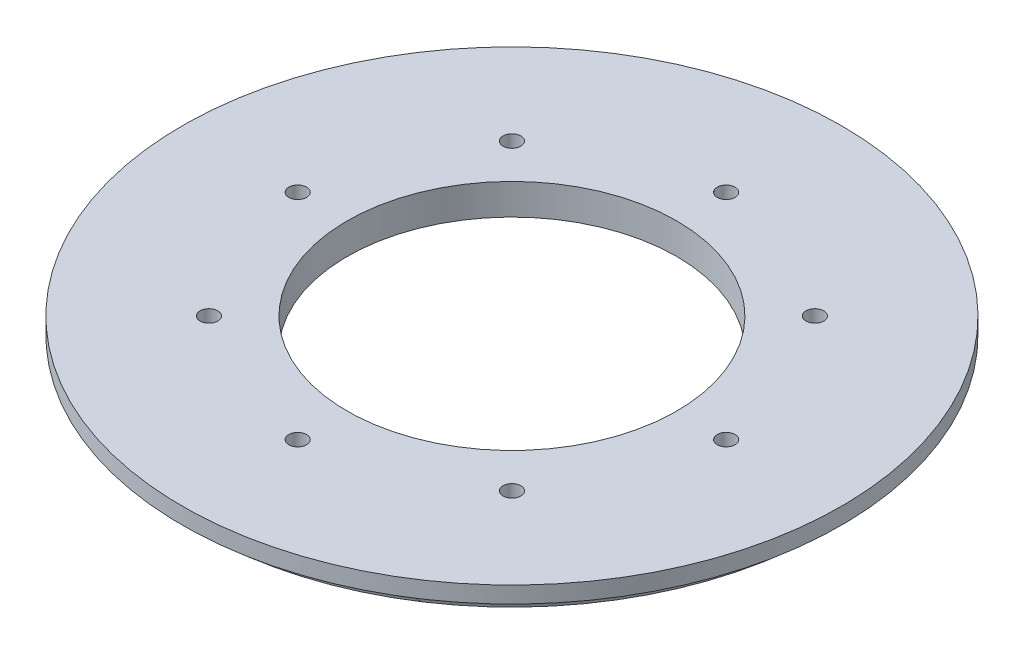
ISO-10303-21;
HEADER;
FILE_DESCRIPTION(('STEP AP214'),'2;1');
FILE_NAME('part.step','',(''),(''),'','','');
FILE_SCHEMA(('AUTOMOTIVE_DESIGN { 1 0 10303 214 1 1 1 1 }'));
ENDSEC;
DATA;
#1=APPLICATION_CONTEXT('core data for automotive mechanical design processes');
#2=APPLICATION_PROTOCOL_DEFINITION('international standard','automotive_design',2000,#1);
#3=PRODUCT_CONTEXT('',#1,'mechanical');
#4=PRODUCT('Part','Part','',(#3));
#5=PRODUCT_RELATED_PRODUCT_CATEGORY('part','',(#4));
#6=PRODUCT_DEFINITION_FORMATION('','',#4);
#7=PRODUCT_DEFINITION_CONTEXT('part definition',#1,'design');
#8=PRODUCT_DEFINITION('design','',#6,#7);
#9=PRODUCT_DEFINITION_SHAPE('','',#8);
#10=(LENGTH_UNIT() NAMED_UNIT(*) SI_UNIT(.MILLI.,.METRE.));
#11=(NAMED_UNIT(*) PLANE_ANGLE_UNIT() SI_UNIT($,.RADIAN.));
#12=(NAMED_UNIT(*) SI_UNIT($,.STERADIAN.) SOLID_ANGLE_UNIT());
#13=UNCERTAINTY_MEASURE_WITH_UNIT(LENGTH_MEASURE(1.E-05),#10,'distance_accuracy_value','');
#14=(GEOMETRIC_REPRESENTATION_CONTEXT(3) GLOBAL_UNCERTAINTY_ASSIGNED_CONTEXT((#13)) GLOBAL_UNIT_ASSIGNED_CONTEXT((#10,
#11,#12)) REPRESENTATION_CONTEXT('',''));
#15=CARTESIAN_POINT('',(0.,0.,0.));
#16=DIRECTION('',(0.,0.,1.));
#17=DIRECTION('',(1.,0.,0.));
#18=AXIS2_PLACEMENT_3D('',#15,#16,#17);
#19=CARTESIAN_POINT('',(0.,4.99993705254392,0.));
#20=DIRECTION('',(0.,-1.,0.));
#21=DIRECTION('',(0.,0.,-1.));
#22=AXIS2_PLACEMENT_3D('',#19,#20,#21);
#23=PLANE('',#22);
#24=CARTESIAN_POINT('',(3.7245254199048E-12,4.99993705254392,0.));
#25=DIRECTION('',(0.,-1.,0.));
#26=DIRECTION('',(0.,0.,-1.));
#27=AXIS2_PLACEMENT_3D('',#24,#25,#26);
#28=CIRCLE('',#27,25.);
#29=CARTESIAN_POINT('',(3.7245254199048E-12,4.99993705254392,-25.));
#30=VERTEX_POINT('',#29);
#31=EDGE_CURVE('E52',#30,#30,#28,.T.);
#32=ORIENTED_EDGE('',*,*,#31,.T.);
#33=EDGE_LOOP('',(#32));
#34=FACE_BOUND('',#33,.T.);
#35=CARTESIAN_POINT('',(0.,4.99993705254392,-32.5));
#36=DIRECTION('',(0.,1.,0.));
#37=DIRECTION('',(0.,0.,1.));
#38=AXIS2_PLACEMENT_3D('',#35,#36,#37);
#39=CIRCLE('',#38,1.35);
#40=CARTESIAN_POINT('',(0.,4.99993705254392,-31.15));
#41=VERTEX_POINT('',#40);
#42=EDGE_CURVE('E91',#41,#41,#39,.T.);
#43=ORIENTED_EDGE('',*,*,#42,.F.);
#44=EDGE_LOOP('',(#43));
#45=FACE_BOUND('',#44,.T.);
#46=CARTESIAN_POINT('',(22.9809703885632,4.99993705254392,-22.9809703885638));
#47=DIRECTION('',(0.,1.,0.));
#48=DIRECTION('',(0.,0.,1.));
#49=AXIS2_PLACEMENT_3D('',#46,#47,#48);
#50=CIRCLE('',#49,1.35000000000016);
#51=CARTESIAN_POINT('',(22.9809703885632,4.99993705254392,-21.6309703885636));
#52=VERTEX_POINT('',#51);
#53=EDGE_CURVE('E85',#52,#52,#50,.T.);
#54=ORIENTED_EDGE('',*,*,#53,.F.);
#55=EDGE_LOOP('',(#54));
#56=FACE_BOUND('',#55,.T.);
#57=CARTESIAN_POINT('',(32.5000000000014,4.99993705254392,-1.38157823263497E-12));
#58=DIRECTION('',(0.,1.,0.));
#59=DIRECTION('',(0.,0.,1.));
#60=AXIS2_PLACEMENT_3D('',#57,#58,#59);
#61=CIRCLE('',#60,1.35000000000103);
#62=CARTESIAN_POINT('',(32.5000000000014,4.99993705254392,1.34999999999965));
#63=VERTEX_POINT('',#62);
#64=EDGE_CURVE('E79',#63,#63,#61,.T.);
#65=ORIENTED_EDGE('',*,*,#64,.F.);
#66=EDGE_LOOP('',(#65));
#67=FACE_BOUND('',#66,.T.);
#68=CARTESIAN_POINT('',(22.9809703885652,4.99993705254392,22.9809703885618));
#69=DIRECTION('',(0.,1.,0.));
#70=DIRECTION('',(0.,0.,1.));
#71=AXIS2_PLACEMENT_3D('',#68,#69,#70);
#72=CIRCLE('',#71,1.35000000000213);
#73=CARTESIAN_POINT('',(22.9809703885652,4.99993705254392,24.3309703885639));
#74=VERTEX_POINT('',#73);
#75=EDGE_CURVE('E73',#74,#74,#72,.T.);
#76=ORIENTED_EDGE('',*,*,#75,.F.);
#77=EDGE_LOOP('',(#76));
#78=FACE_BOUND('',#77,.T.);
#79=CARTESIAN_POINT('',(2.76315646526993E-12,4.99993705254392,32.5));
#80=DIRECTION('',(0.,1.,0.));
#81=DIRECTION('',(0.,0.,1.));
#82=AXIS2_PLACEMENT_3D('',#79,#80,#81);
#83=CIRCLE('',#82,1.35000000000286);
#84=CARTESIAN_POINT('',(2.76315646526993E-12,4.99993705254392,33.8500000000029));
#85=VERTEX_POINT('',#84);
#86=EDGE_CURVE('E67',#85,#85,#83,.T.);
#87=ORIENTED_EDGE('',*,*,#86,.F.);
#88=EDGE_LOOP('',(#87));
#89=FACE_BOUND('',#88,.T.);
#90=CARTESIAN_POINT('',(-22.9809703885604,4.99993705254392,22.9809703885638));
#91=DIRECTION('',(0.,1.,0.));
#92=DIRECTION('',(0.,0.,1.));
#93=AXIS2_PLACEMENT_3D('',#90,#91,#92);
#94=CIRCLE('',#93,1.35000000000281);
#95=CARTESIAN_POINT('',(-22.9809703885604,4.99993705254392,24.3309703885666));
#96=VERTEX_POINT('',#95);
#97=EDGE_CURVE('E61',#96,#96,#94,.T.);
#98=ORIENTED_EDGE('',*,*,#97,.F.);
#99=EDGE_LOOP('',(#98));
#100=FACE_BOUND('',#99,.T.);
#101=CARTESIAN_POINT('',(-32.4999999999986,4.99993705254392,1.3855583347322E-12));
#102=DIRECTION('',(0.,1.,0.));
#103=DIRECTION('',(0.,0.,1.));
#104=AXIS2_PLACEMENT_3D('',#101,#102,#103);
#105=CIRCLE('',#104,1.35000000000205);
#106=CARTESIAN_POINT('',(-32.4999999999986,4.99993705254392,1.35000000000344));
#107=VERTEX_POINT('',#106);
#108=EDGE_CURVE('E55',#107,#107,#105,.T.);
#109=ORIENTED_EDGE('',*,*,#108,.F.);
#110=EDGE_LOOP('',(#109));
#111=FACE_BOUND('',#110,.T.);
#112=CARTESIAN_POINT('',(-22.9809703885624,4.99993705254392,-22.9809703885618));
#113=DIRECTION('',(0.,1.,0.));
#114=DIRECTION('',(0.,0.,1.));
#115=AXIS2_PLACEMENT_3D('',#112,#113,#114);
#116=CIRCLE('',#115,1.35000000000106);
#117=CARTESIAN_POINT('',(-22.9809703885624,4.99993705254392,-21.6309703885608));
#118=VERTEX_POINT('',#117);
#119=EDGE_CURVE('E48',#118,#118,#116,.T.);
#120=ORIENTED_EDGE('',*,*,#119,.F.);
#121=EDGE_LOOP('',(#120));
#122=FACE_BOUND('',#121,.T.);
#123=CARTESIAN_POINT('',(0.,4.99993705254392,0.));
#124=DIRECTION('',(0.,-1.,0.));
#125=DIRECTION('',(0.,0.,-1.));
#126=AXIS2_PLACEMENT_3D('',#123,#124,#125);
#127=CIRCLE('',#126,50.);
#128=CARTESIAN_POINT('',(0.,4.99993705254392,-50.));
#129=VERTEX_POINT('',#128);
#130=EDGE_CURVE('E10',#129,#129,#127,.T.);
#131=ORIENTED_EDGE('',*,*,#130,.F.);
#132=EDGE_LOOP('',(#131));
#133=FACE_BOUND('',#132,.T.);
#134=ADVANCED_FACE('F31',(#34,#45,#56,#67,#78,#89,#100,#111,#122,#133),#23,.F.);
#135=CARTESIAN_POINT('',(0.,0.315015274632571,0.));
#136=DIRECTION('',(0.,-1.,0.));
#137=DIRECTION('',(0.,0.,-1.));
#138=AXIS2_PLACEMENT_3D('',#135,#136,#137);
#139=CYLINDRICAL_SURFACE('',#138,50.);
#140=ORIENTED_EDGE('',*,*,#130,.T.);
#141=EDGE_LOOP('',(#140));
#142=FACE_BOUND('',#141,.T.);
#143=CARTESIAN_POINT('',(0.,2.49981114930994,0.));
#144=DIRECTION('',(0.,-1.,0.));
#145=DIRECTION('',(0.,0.,-1.));
#146=AXIS2_PLACEMENT_3D('',#143,#144,#145);
#147=CIRCLE('',#146,50.);
#148=CARTESIAN_POINT('',(0.,2.49981114930994,-50.));
#149=VERTEX_POINT('',#148);
#150=EDGE_CURVE('E37',#149,#149,#147,.T.);
#151=ORIENTED_EDGE('',*,*,#150,.F.);
#152=EDGE_LOOP('',(#151));
#153=FACE_BOUND('',#152,.T.);
#154=ADVANCED_FACE('F136',(#142,#153),#139,.T.);
#155=CARTESIAN_POINT('',(0.,6.29462673962548E-05,0.));
#156=DIRECTION('',(0.,-1.,0.));
#157=DIRECTION('',(0.,0.,-1.));
#158=AXIS2_PLACEMENT_3D('',#155,#156,#157);
#159=TOROIDAL_SURFACE('',#158,49.9645187178138,2.5);
#160=ORIENTED_EDGE('',*,*,#150,.T.);
#161=EDGE_LOOP('',(#160));
#162=FACE_BOUND('',#161,.T.);
#163=CARTESIAN_POINT('',(0.,0.315015274632574,0.));
#164=DIRECTION('',(0.,-1.,0.));
#165=DIRECTION('',(0.,0.,-1.));
#166=AXIS2_PLACEMENT_3D('',#163,#164,#165);
#167=CIRCLE('',#166,47.4844370597111);
#168=CARTESIAN_POINT('',(0.,0.315015274632574,-47.4844370597111));
#169=VERTEX_POINT('',#168);
#170=EDGE_CURVE('E41',#169,#169,#167,.T.);
#171=ORIENTED_EDGE('',*,*,#170,.F.);
#172=EDGE_LOOP('',(#171));
#173=FACE_BOUND('',#172,.T.);
#174=ADVANCED_FACE('F115',(#162,#173),#159,.F.);
#175=CARTESIAN_POINT('',(0.,0.315015274632573,0.));
#176=DIRECTION('',(0.,-1.,0.));
#177=DIRECTION('',(0.,0.,-1.));
#178=AXIS2_PLACEMENT_3D('',#175,#176,#177);
#179=PLANE('',#178);
#180=CARTESIAN_POINT('',(3.7245254199048E-12,0.315015274632573,0.));
#181=DIRECTION('',(0.,-1.,0.));
#182=DIRECTION('',(0.,0.,-1.));
#183=AXIS2_PLACEMENT_3D('',#180,#181,#182);
#184=CIRCLE('',#183,25.);
#185=CARTESIAN_POINT('',(3.7245254199048E-12,0.315015274632573,-25.));
#186=VERTEX_POINT('',#185);
#187=EDGE_CURVE('E96',#186,#186,#184,.T.);
#188=ORIENTED_EDGE('',*,*,#187,.F.);
#189=EDGE_LOOP('',(#188));
#190=FACE_BOUND('',#189,.T.);
#191=CARTESIAN_POINT('',(0.,0.315015274632575,-32.5));
#192=DIRECTION('',(0.,1.,0.));
#193=DIRECTION('',(0.,0.,1.));
#194=AXIS2_PLACEMENT_3D('',#191,#192,#193);
#195=CIRCLE('',#194,1.35);
#196=CARTESIAN_POINT('',(0.,0.315015274632575,-31.15));
#197=VERTEX_POINT('',#196);
#198=EDGE_CURVE('E45',#197,#197,#195,.T.);
#199=ORIENTED_EDGE('',*,*,#198,.T.);
#200=EDGE_LOOP('',(#199));
#201=FACE_BOUND('',#200,.T.);
#202=CARTESIAN_POINT('',(22.9809703885632,0.315015274632575,-22.9809703885638));
#203=DIRECTION('',(0.,1.,0.));
#204=DIRECTION('',(0.,0.,1.));
#205=AXIS2_PLACEMENT_3D('',#202,#203,#204);
#206=CIRCLE('',#205,1.35000000000016);
#207=CARTESIAN_POINT('',(22.9809703885632,0.315015274632575,-21.6309703885636));
#208=VERTEX_POINT('',#207);
#209=EDGE_CURVE('E88',#208,#208,#206,.T.);
#210=ORIENTED_EDGE('',*,*,#209,.T.);
#211=EDGE_LOOP('',(#210));
#212=FACE_BOUND('',#211,.T.);
#213=CARTESIAN_POINT('',(32.5000000000014,0.315015274632575,-1.38157823263497E-12));
#214=DIRECTION('',(0.,1.,0.));
#215=DIRECTION('',(0.,0.,1.));
#216=AXIS2_PLACEMENT_3D('',#213,#214,#215);
#217=CIRCLE('',#216,1.35000000000103);
#218=CARTESIAN_POINT('',(32.5000000000014,0.315015274632575,1.34999999999965));
#219=VERTEX_POINT('',#218);
#220=EDGE_CURVE('E82',#219,#219,#217,.T.);
#221=ORIENTED_EDGE('',*,*,#220,.T.);
#222=EDGE_LOOP('',(#221));
#223=FACE_BOUND('',#222,.T.);
#224=CARTESIAN_POINT('',(22.9809703885652,0.315015274632575,22.9809703885618));
#225=DIRECTION('',(0.,1.,0.));
#226=DIRECTION('',(0.,0.,1.));
#227=AXIS2_PLACEMENT_3D('',#224,#225,#226);
#228=CIRCLE('',#227,1.35000000000213);
#229=CARTESIAN_POINT('',(22.9809703885652,0.315015274632575,24.3309703885639));
#230=VERTEX_POINT('',#229);
#231=EDGE_CURVE('E76',#230,#230,#228,.T.);
#232=ORIENTED_EDGE('',*,*,#231,.T.);
#233=EDGE_LOOP('',(#232));
#234=FACE_BOUND('',#233,.T.);
#235=CARTESIAN_POINT('',(2.76315646526993E-12,0.315015274632575,32.5));
#236=DIRECTION('',(0.,1.,0.));
#237=DIRECTION('',(0.,0.,1.));
#238=AXIS2_PLACEMENT_3D('',#235,#236,#237);
#239=CIRCLE('',#238,1.35000000000286);
#240=CARTESIAN_POINT('',(2.76315646526993E-12,0.315015274632575,33.8500000000029));
#241=VERTEX_POINT('',#240);
#242=EDGE_CURVE('E70',#241,#241,#239,.T.);
#243=ORIENTED_EDGE('',*,*,#242,.T.);
#244=EDGE_LOOP('',(#243));
#245=FACE_BOUND('',#244,.T.);
#246=CARTESIAN_POINT('',(-22.9809703885604,0.315015274632575,22.9809703885638));
#247=DIRECTION('',(0.,1.,0.));
#248=DIRECTION('',(0.,0.,1.));
#249=AXIS2_PLACEMENT_3D('',#246,#247,#248);
#250=CIRCLE('',#249,1.35000000000281);
#251=CARTESIAN_POINT('',(-22.9809703885604,0.315015274632575,24.3309703885666));
#252=VERTEX_POINT('',#251);
#253=EDGE_CURVE('E64',#252,#252,#250,.T.);
#254=ORIENTED_EDGE('',*,*,#253,.T.);
#255=EDGE_LOOP('',(#254));
#256=FACE_BOUND('',#255,.T.);
#257=CARTESIAN_POINT('',(-32.4999999999986,0.315015274632575,1.3855583347322E-12));
#258=DIRECTION('',(0.,1.,0.));
#259=DIRECTION('',(0.,0.,1.));
#260=AXIS2_PLACEMENT_3D('',#257,#258,#259);
#261=CIRCLE('',#260,1.35000000000205);
#262=CARTESIAN_POINT('',(-32.4999999999986,0.315015274632575,1.35000000000344));
#263=VERTEX_POINT('',#262);
#264=EDGE_CURVE('E58',#263,#263,#261,.T.);
#265=ORIENTED_EDGE('',*,*,#264,.T.);
#266=EDGE_LOOP('',(#265));
#267=FACE_BOUND('',#266,.T.);
#268=CARTESIAN_POINT('',(-22.9809703885624,0.315015274632575,-22.9809703885618));
#269=DIRECTION('',(0.,1.,0.));
#270=DIRECTION('',(0.,0.,1.));
#271=AXIS2_PLACEMENT_3D('',#268,#269,#270);
#272=CIRCLE('',#271,1.35000000000106);
#273=CARTESIAN_POINT('',(-22.9809703885624,0.315015274632575,-21.6309703885608));
#274=VERTEX_POINT('',#273);
#275=EDGE_CURVE('E51',#274,#274,#272,.T.);
#276=ORIENTED_EDGE('',*,*,#275,.T.);
#277=EDGE_LOOP('',(#276));
#278=FACE_BOUND('',#277,.T.);
#279=ORIENTED_EDGE('',*,*,#170,.T.);
#280=EDGE_LOOP('',(#279));
#281=FACE_BOUND('',#280,.T.);
#282=ADVANCED_FACE('F111',(#190,#201,#212,#223,#234,#245,#256,#267,#278,#281),#179,.T.);
#283=CARTESIAN_POINT('',(-22.9809703885624,0.315015274632575,-22.9809703885618));
#284=DIRECTION('',(0.,1.,0.));
#285=DIRECTION('',(0.,0.,1.));
#286=AXIS2_PLACEMENT_3D('',#283,#284,#285);
#287=CYLINDRICAL_SURFACE('',#286,1.35000000000106);
#288=ORIENTED_EDGE('',*,*,#275,.F.);
#289=EDGE_LOOP('',(#288));
#290=FACE_BOUND('',#289,.T.);
#291=ORIENTED_EDGE('',*,*,#119,.T.);
#292=EDGE_LOOP('',(#291));
#293=FACE_BOUND('',#292,.T.);
#294=ADVANCED_FACE('F114',(#290,#293),#287,.F.);
#295=CARTESIAN_POINT('',(-32.4999999999986,0.315015274632575,1.3855583347322E-12));
#296=DIRECTION('',(0.,1.,0.));
#297=DIRECTION('',(0.,0.,1.));
#298=AXIS2_PLACEMENT_3D('',#295,#296,#297);
#299=CYLINDRICAL_SURFACE('',#298,1.35000000000205);
#300=ORIENTED_EDGE('',*,*,#264,.F.);
#301=EDGE_LOOP('',(#300));
#302=FACE_BOUND('',#301,.T.);
#303=ORIENTED_EDGE('',*,*,#108,.T.);
#304=EDGE_LOOP('',(#303));
#305=FACE_BOUND('',#304,.T.);
#306=ADVANCED_FACE('F164',(#302,#305),#299,.F.);
#307=CARTESIAN_POINT('',(-22.9809703885604,0.315015274632575,22.9809703885638));
#308=DIRECTION('',(0.,1.,0.));
#309=DIRECTION('',(0.,0.,1.));
#310=AXIS2_PLACEMENT_3D('',#307,#308,#309);
#311=CYLINDRICAL_SURFACE('',#310,1.35000000000281);
#312=ORIENTED_EDGE('',*,*,#253,.F.);
#313=EDGE_LOOP('',(#312));
#314=FACE_BOUND('',#313,.T.);
#315=ORIENTED_EDGE('',*,*,#97,.T.);
#316=EDGE_LOOP('',(#315));
#317=FACE_BOUND('',#316,.T.);
#318=ADVANCED_FACE('F174',(#314,#317),#311,.F.);
#319=CARTESIAN_POINT('',(2.76315646526993E-12,0.315015274632575,32.5));
#320=DIRECTION('',(0.,1.,0.));
#321=DIRECTION('',(0.,0.,1.));
#322=AXIS2_PLACEMENT_3D('',#319,#320,#321);
#323=CYLINDRICAL_SURFACE('',#322,1.35000000000286);
#324=ORIENTED_EDGE('',*,*,#242,.F.);
#325=EDGE_LOOP('',(#324));
#326=FACE_BOUND('',#325,.T.);
#327=ORIENTED_EDGE('',*,*,#86,.T.);
#328=EDGE_LOOP('',(#327));
#329=FACE_BOUND('',#328,.T.);
#330=ADVANCED_FACE('F184',(#326,#329),#323,.F.);
#331=CARTESIAN_POINT('',(22.9809703885652,0.315015274632575,22.9809703885618));
#332=DIRECTION('',(0.,1.,0.));
#333=DIRECTION('',(0.,0.,1.));
#334=AXIS2_PLACEMENT_3D('',#331,#332,#333);
#335=CYLINDRICAL_SURFACE('',#334,1.35000000000213);
#336=ORIENTED_EDGE('',*,*,#231,.F.);
#337=EDGE_LOOP('',(#336));
#338=FACE_BOUND('',#337,.T.);
#339=ORIENTED_EDGE('',*,*,#75,.T.);
#340=EDGE_LOOP('',(#339));
#341=FACE_BOUND('',#340,.T.);
#342=ADVANCED_FACE('F194',(#338,#341),#335,.F.);
#343=CARTESIAN_POINT('',(32.5000000000014,0.315015274632575,-1.38157823263497E-12));
#344=DIRECTION('',(0.,1.,0.));
#345=DIRECTION('',(0.,0.,1.));
#346=AXIS2_PLACEMENT_3D('',#343,#344,#345);
#347=CYLINDRICAL_SURFACE('',#346,1.35000000000103);
#348=ORIENTED_EDGE('',*,*,#220,.F.);
#349=EDGE_LOOP('',(#348));
#350=FACE_BOUND('',#349,.T.);
#351=ORIENTED_EDGE('',*,*,#64,.T.);
#352=EDGE_LOOP('',(#351));
#353=FACE_BOUND('',#352,.T.);
#354=ADVANCED_FACE('F204',(#350,#353),#347,.F.);
#355=CARTESIAN_POINT('',(22.9809703885632,0.315015274632575,-22.9809703885638));
#356=DIRECTION('',(0.,1.,0.));
#357=DIRECTION('',(0.,0.,1.));
#358=AXIS2_PLACEMENT_3D('',#355,#356,#357);
#359=CYLINDRICAL_SURFACE('',#358,1.35000000000016);
#360=ORIENTED_EDGE('',*,*,#209,.F.);
#361=EDGE_LOOP('',(#360));
#362=FACE_BOUND('',#361,.T.);
#363=ORIENTED_EDGE('',*,*,#53,.T.);
#364=EDGE_LOOP('',(#363));
#365=FACE_BOUND('',#364,.T.);
#366=ADVANCED_FACE('F214',(#362,#365),#359,.F.);
#367=CARTESIAN_POINT('',(0.,0.315015274632575,-32.5));
#368=DIRECTION('',(0.,1.,0.));
#369=DIRECTION('',(0.,0.,1.));
#370=AXIS2_PLACEMENT_3D('',#367,#368,#369);
#371=CYLINDRICAL_SURFACE('',#370,1.35);
#372=ORIENTED_EDGE('',*,*,#198,.F.);
#373=EDGE_LOOP('',(#372));
#374=FACE_BOUND('',#373,.T.);
#375=ORIENTED_EDGE('',*,*,#42,.T.);
#376=EDGE_LOOP('',(#375));
#377=FACE_BOUND('',#376,.T.);
#378=ADVANCED_FACE('F107',(#374,#377),#371,.F.);
#379=CARTESIAN_POINT('',(3.7245254199048E-12,4.99993705254392,0.));
#380=DIRECTION('',(0.,-1.,0.));
#381=DIRECTION('',(0.,0.,-1.));
#382=AXIS2_PLACEMENT_3D('',#379,#380,#381);
#383=CYLINDRICAL_SURFACE('',#382,25.);
#384=ORIENTED_EDGE('',*,*,#31,.F.);
#385=EDGE_LOOP('',(#384));
#386=FACE_BOUND('',#385,.T.);
#387=ORIENTED_EDGE('',*,*,#187,.T.);
#388=EDGE_LOOP('',(#387));
#389=FACE_BOUND('',#388,.T.);
#390=ADVANCED_FACE('F104',(#386,#389),#383,.F.);
#391=CLOSED_SHELL('',(#134,#154,#174,#282,#294,#306,#318,#330,#342,#354,#366,#378,#390));
#392=MANIFOLD_SOLID_BREP('B2',#391);
#393=ADVANCED_BREP_SHAPE_REPRESENTATION('',(#18,#392),#14);
#394=SHAPE_DEFINITION_REPRESENTATION(#9,#393);
ENDSEC;
END-ISO-10303-21;
